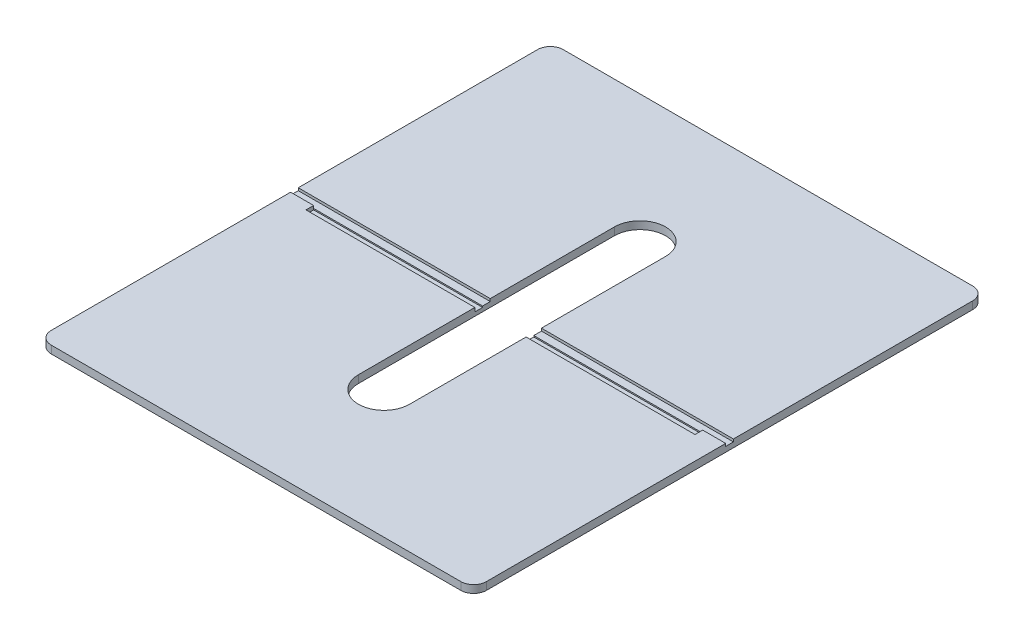
ISO-10303-21;
HEADER;
FILE_DESCRIPTION(('STEP AP214'),'2;1');
FILE_NAME('part.step','',(''),(''),'','','');
FILE_SCHEMA(('AUTOMOTIVE_DESIGN { 1 0 10303 214 1 1 1 1 }'));
ENDSEC;
DATA;
#1=APPLICATION_CONTEXT('core data for automotive mechanical design processes');
#2=APPLICATION_PROTOCOL_DEFINITION('international standard','automotive_design',2000,#1);
#3=PRODUCT_CONTEXT('',#1,'mechanical');
#4=PRODUCT('Part','Part','',(#3));
#5=PRODUCT_RELATED_PRODUCT_CATEGORY('part','',(#4));
#6=PRODUCT_DEFINITION_FORMATION('','',#4);
#7=PRODUCT_DEFINITION_CONTEXT('part definition',#1,'design');
#8=PRODUCT_DEFINITION('design','',#6,#7);
#9=PRODUCT_DEFINITION_SHAPE('','',#8);
#10=(LENGTH_UNIT() NAMED_UNIT(*) SI_UNIT(.MILLI.,.METRE.));
#11=(NAMED_UNIT(*) PLANE_ANGLE_UNIT() SI_UNIT($,.RADIAN.));
#12=(NAMED_UNIT(*) SI_UNIT($,.STERADIAN.) SOLID_ANGLE_UNIT());
#13=UNCERTAINTY_MEASURE_WITH_UNIT(LENGTH_MEASURE(1.E-05),#10,'distance_accuracy_value','');
#14=(GEOMETRIC_REPRESENTATION_CONTEXT(3) GLOBAL_UNCERTAINTY_ASSIGNED_CONTEXT((#13)) GLOBAL_UNIT_ASSIGNED_CONTEXT((#10,
#11,#12)) REPRESENTATION_CONTEXT('',''));
#15=CARTESIAN_POINT('',(0.,0.,0.));
#16=DIRECTION('',(0.,0.,1.));
#17=DIRECTION('',(1.,0.,0.));
#18=AXIS2_PLACEMENT_3D('',#15,#16,#17);
#19=CARTESIAN_POINT('',(0.,1.5,0.));
#20=DIRECTION('',(0.,1.,0.));
#21=DIRECTION('',(0.,0.,1.));
#22=AXIS2_PLACEMENT_3D('',#19,#20,#21);
#23=PLANE('',#22);
#24=DIRECTION('',(1.,0.,0.));
#25=VECTOR('',#24,1.);
#26=CARTESIAN_POINT('',(88.2289372576365,1.5,1.49999999999997));
#27=LINE('',#26,#25);
#28=CARTESIAN_POINT('',(-85.,1.5,1.50000000000002));
#29=VERTEX_POINT('',#28);
#30=CARTESIAN_POINT('',(-76.,1.5,1.5));
#31=VERTEX_POINT('',#30);
#32=EDGE_CURVE('E226',#29,#31,#27,.T.);
#33=ORIENTED_EDGE('',*,*,#32,.F.);
#34=DIRECTION('',(0.,0.,1.));
#35=VECTOR('',#34,1.);
#36=CARTESIAN_POINT('',(-85.,1.5,0.));
#37=LINE('',#36,#35);
#38=CARTESIAN_POINT('',(-85.,1.5,94.9999999999999));
#39=VERTEX_POINT('',#38);
#40=EDGE_CURVE('E239',#29,#39,#37,.T.);
#41=ORIENTED_EDGE('',*,*,#40,.T.);
#42=CARTESIAN_POINT('',(-80.,1.5,95.));
#43=DIRECTION('',(0.,1.,0.));
#44=DIRECTION('',(0.,0.,1.));
#45=AXIS2_PLACEMENT_3D('',#42,#43,#44);
#46=CIRCLE('',#45,5.);
#47=CARTESIAN_POINT('',(-79.9999999999999,1.5,100.));
#48=VERTEX_POINT('',#47);
#49=EDGE_CURVE('E254',#48,#39,#46,.F.);
#50=ORIENTED_EDGE('',*,*,#49,.F.);
#51=DIRECTION('',(1.,0.,0.));
#52=VECTOR('',#51,1.);
#53=CARTESIAN_POINT('',(0.,1.5,100.));
#54=LINE('',#53,#52);
#55=CARTESIAN_POINT('',(80.,1.5,100.));
#56=VERTEX_POINT('',#55);
#57=EDGE_CURVE('E261',#48,#56,#54,.T.);
#58=ORIENTED_EDGE('',*,*,#57,.T.);
#59=CARTESIAN_POINT('',(80.,1.5,95.));
#60=DIRECTION('',(0.,1.,0.));
#61=DIRECTION('',(0.,0.,1.));
#62=AXIS2_PLACEMENT_3D('',#59,#60,#61);
#63=CIRCLE('',#62,5.);
#64=CARTESIAN_POINT('',(85.,1.5,94.9999999999999));
#65=VERTEX_POINT('',#64);
#66=EDGE_CURVE('E263',#65,#56,#63,.F.);
#67=ORIENTED_EDGE('',*,*,#66,.F.);
#68=DIRECTION('',(0.,0.,1.));
#69=VECTOR('',#68,1.);
#70=CARTESIAN_POINT('',(85.,1.5,0.));
#71=LINE('',#70,#69);
#72=CARTESIAN_POINT('',(85.,1.5,1.49999999999997));
#73=VERTEX_POINT('',#72);
#74=EDGE_CURVE('E266',#73,#65,#71,.T.);
#75=ORIENTED_EDGE('',*,*,#74,.F.);
#76=CARTESIAN_POINT('',(76.,1.5,1.49999999999997));
#77=VERTEX_POINT('',#76);
#78=EDGE_CURVE('E244',#77,#73,#27,.T.);
#79=ORIENTED_EDGE('',*,*,#78,.F.);
#80=DIRECTION('',(0.,0.,1.));
#81=VECTOR('',#80,1.);
#82=CARTESIAN_POINT('',(76.,1.5,-3.51570624464633E-13));
#83=LINE('',#82,#81);
#84=CARTESIAN_POINT('',(76.,1.5,4.5));
#85=VERTEX_POINT('',#84);
#86=EDGE_CURVE('E328',#77,#85,#83,.T.);
#87=ORIENTED_EDGE('',*,*,#86,.T.);
#88=DIRECTION('',(-1.,0.,0.));
#89=VECTOR('',#88,1.);
#90=CARTESIAN_POINT('',(0.,1.5,4.5));
#91=LINE('',#90,#89);
#92=CARTESIAN_POINT('',(10.,1.5,4.5));
#93=VERTEX_POINT('',#92);
#94=EDGE_CURVE('E337',#85,#93,#91,.T.);
#95=ORIENTED_EDGE('',*,*,#94,.T.);
#96=DIRECTION('',(0.,0.,1.));
#97=VECTOR('',#96,1.);
#98=CARTESIAN_POINT('',(10.,1.5,0.));
#99=LINE('',#98,#97);
#100=CARTESIAN_POINT('',(10.,1.5,50.));
#101=VERTEX_POINT('',#100);
#102=EDGE_CURVE('E400',#93,#101,#99,.T.);
#103=ORIENTED_EDGE('',*,*,#102,.T.);
#104=CARTESIAN_POINT('',(0.,1.5,50.));
#105=DIRECTION('',(0.,1.,0.));
#106=DIRECTION('',(0.,0.,1.));
#107=AXIS2_PLACEMENT_3D('',#104,#105,#106);
#108=CIRCLE('',#107,10.);
#109=CARTESIAN_POINT('',(-10.,1.5,50.));
#110=VERTEX_POINT('',#109);
#111=EDGE_CURVE('E310',#110,#101,#108,.T.);
#112=ORIENTED_EDGE('',*,*,#111,.F.);
#113=DIRECTION('',(0.,0.,1.));
#114=VECTOR('',#113,1.);
#115=CARTESIAN_POINT('',(-10.,1.5,0.));
#116=LINE('',#115,#114);
#117=CARTESIAN_POINT('',(-10.,1.5,4.5));
#118=VERTEX_POINT('',#117);
#119=EDGE_CURVE('E393',#118,#110,#116,.T.);
#120=ORIENTED_EDGE('',*,*,#119,.F.);
#121=CARTESIAN_POINT('',(-76.,1.5,4.5));
#122=VERTEX_POINT('',#121);
#123=EDGE_CURVE('E340',#118,#122,#91,.T.);
#124=ORIENTED_EDGE('',*,*,#123,.T.);
#125=DIRECTION('',(0.,0.,-1.));
#126=VECTOR('',#125,1.);
#127=CARTESIAN_POINT('',(-76.,1.5,3.51570624464633E-13));
#128=LINE('',#127,#126);
#129=EDGE_CURVE('E242',#122,#31,#128,.T.);
#130=ORIENTED_EDGE('',*,*,#129,.T.);
#131=EDGE_LOOP('',(#33,#41,#50,#58,#67,#75,#79,#87,#95,#103,#112,#120,#124,#130));
#132=FACE_BOUND('',#131,.T.);
#133=ADVANCED_FACE('F43',(#132),#23,.T.);
#134=CARTESIAN_POINT('',(-76.,1.500012,1.5));
#135=DIRECTION('',(0.,0.,1.));
#136=DIRECTION('',(1.,0.,0.));
#137=AXIS2_PLACEMENT_3D('',#134,#135,#136);
#138=PLANE('',#137);
#139=DIRECTION('',(0.,-1.,0.));
#140=VECTOR('',#139,1.);
#141=CARTESIAN_POINT('',(76.,1.500012,1.5));
#142=LINE('',#141,#140);
#143=CARTESIAN_POINT('',(76.,0.5,1.49999999999997));
#144=VERTEX_POINT('',#143);
#145=CARTESIAN_POINT('',(76.,0.,1.5));
#146=VERTEX_POINT('',#145);
#147=EDGE_CURVE('E373',#144,#146,#142,.T.);
#148=ORIENTED_EDGE('',*,*,#147,.F.);
#149=DIRECTION('',(1.,0.,0.));
#150=VECTOR('',#149,1.);
#151=CARTESIAN_POINT('',(88.2289372576365,0.5,1.49999999999997));
#152=LINE('',#151,#150);
#153=CARTESIAN_POINT('',(10.,0.5,1.5));
#154=VERTEX_POINT('',#153);
#155=EDGE_CURVE('E464',#154,#144,#152,.T.);
#156=ORIENTED_EDGE('',*,*,#155,.F.);
#157=DIRECTION('',(0.,-1.,0.));
#158=VECTOR('',#157,1.);
#159=CARTESIAN_POINT('',(10.,1.5,1.5));
#160=LINE('',#159,#158);
#161=CARTESIAN_POINT('',(10.,0.,1.5));
#162=VERTEX_POINT('',#161);
#163=EDGE_CURVE('E346',#154,#162,#160,.T.);
#164=ORIENTED_EDGE('',*,*,#163,.T.);
#165=DIRECTION('',(-1.,0.,0.));
#166=VECTOR('',#165,1.);
#167=CARTESIAN_POINT('',(-76.,0.,1.5));
#168=LINE('',#167,#166);
#169=EDGE_CURVE('E357',#146,#162,#168,.T.);
#170=ORIENTED_EDGE('',*,*,#169,.F.);
#171=EDGE_LOOP('',(#148,#156,#164,#170));
#172=FACE_BOUND('',#171,.T.);
#173=ADVANCED_FACE('F501',(#172),#138,.T.);
#174=DIRECTION('',(0.,-1.,0.));
#175=VECTOR('',#174,1.);
#176=CARTESIAN_POINT('',(-10.,1.5,1.5));
#177=LINE('',#176,#175);
#178=CARTESIAN_POINT('',(-10.,0.5,1.5));
#179=VERTEX_POINT('',#178);
#180=CARTESIAN_POINT('',(-10.,0.,1.5));
#181=VERTEX_POINT('',#180);
#182=EDGE_CURVE('E387',#179,#181,#177,.T.);
#183=ORIENTED_EDGE('',*,*,#182,.F.);
#184=CARTESIAN_POINT('',(-76.,0.5,1.50000000000002));
#185=VERTEX_POINT('',#184);
#186=EDGE_CURVE('E462',#185,#179,#152,.T.);
#187=ORIENTED_EDGE('',*,*,#186,.F.);
#188=DIRECTION('',(0.,-1.,0.));
#189=VECTOR('',#188,1.);
#190=CARTESIAN_POINT('',(-76.,1.500012,1.5));
#191=LINE('',#190,#189);
#192=CARTESIAN_POINT('',(-76.,0.,1.5));
#193=VERTEX_POINT('',#192);
#194=EDGE_CURVE('E379',#185,#193,#191,.T.);
#195=ORIENTED_EDGE('',*,*,#194,.T.);
#196=EDGE_CURVE('E443',#181,#193,#168,.T.);
#197=ORIENTED_EDGE('',*,*,#196,.F.);
#198=EDGE_LOOP('',(#183,#187,#195,#197));
#199=FACE_BOUND('',#198,.T.);
#200=ADVANCED_FACE('F461',(#199),#138,.T.);
#201=CARTESIAN_POINT('',(-10.,1.5,0.));
#202=DIRECTION('',(1.,0.,0.));
#203=DIRECTION('',(0.,0.,-1.));
#204=AXIS2_PLACEMENT_3D('',#201,#202,#203);
#205=PLANE('',#204);
#206=DIRECTION('',(0.,1.,0.));
#207=VECTOR('',#206,1.);
#208=CARTESIAN_POINT('',(-10.,1.5,-1.5));
#209=LINE('',#208,#207);
#210=CARTESIAN_POINT('',(-10.,0.5,-1.5));
#211=VERTEX_POINT('',#210);
#212=CARTESIAN_POINT('',(-10.,1.5,-1.5));
#213=VERTEX_POINT('',#212);
#214=EDGE_CURVE('E437',#211,#213,#209,.T.);
#215=ORIENTED_EDGE('',*,*,#214,.F.);
#216=DIRECTION('',(0.,0.,1.));
#217=VECTOR('',#216,1.);
#218=CARTESIAN_POINT('',(-10.,0.5,0.));
#219=LINE('',#218,#217);
#220=EDGE_CURVE('E434',#211,#179,#219,.T.);
#221=ORIENTED_EDGE('',*,*,#220,.T.);
#222=ORIENTED_EDGE('',*,*,#182,.T.);
#223=DIRECTION('',(0.,0.,-1.));
#224=VECTOR('',#223,1.);
#225=CARTESIAN_POINT('',(-10.,0.,0.));
#226=LINE('',#225,#224);
#227=CARTESIAN_POINT('',(-10.,0.,4.5));
#228=VERTEX_POINT('',#227);
#229=EDGE_CURVE('E278',#228,#181,#226,.T.);
#230=ORIENTED_EDGE('',*,*,#229,.F.);
#231=DIRECTION('',(0.,1.,0.));
#232=VECTOR('',#231,1.);
#233=CARTESIAN_POINT('',(-10.,1.5,4.5));
#234=LINE('',#233,#232);
#235=EDGE_CURVE('E382',#228,#118,#234,.T.);
#236=ORIENTED_EDGE('',*,*,#235,.T.);
#237=ORIENTED_EDGE('',*,*,#119,.T.);
#238=DIRECTION('',(0.,-1.,0.));
#239=VECTOR('',#238,1.);
#240=CARTESIAN_POINT('',(-10.,1.5,50.));
#241=LINE('',#240,#239);
#242=CARTESIAN_POINT('',(-10.,-1.5,50.));
#243=VERTEX_POINT('',#242);
#244=EDGE_CURVE('E314',#110,#243,#241,.T.);
#245=ORIENTED_EDGE('',*,*,#244,.T.);
#246=DIRECTION('',(0.,0.,1.));
#247=VECTOR('',#246,1.);
#248=CARTESIAN_POINT('',(-10.,-1.5,0.));
#249=LINE('',#248,#247);
#250=CARTESIAN_POINT('',(-10.,-1.5,-50.));
#251=VERTEX_POINT('',#250);
#252=EDGE_CURVE('E277',#251,#243,#249,.T.);
#253=ORIENTED_EDGE('',*,*,#252,.F.);
#254=DIRECTION('',(0.,-1.,0.));
#255=VECTOR('',#254,1.);
#256=CARTESIAN_POINT('',(-10.,1.5,-50.));
#257=LINE('',#256,#255);
#258=CARTESIAN_POINT('',(-10.,1.5,-50.));
#259=VERTEX_POINT('',#258);
#260=EDGE_CURVE('E332',#259,#251,#257,.T.);
#261=ORIENTED_EDGE('',*,*,#260,.F.);
#262=EDGE_CURVE('E394',#259,#213,#116,.T.);
#263=ORIENTED_EDGE('',*,*,#262,.T.);
#264=EDGE_LOOP('',(#215,#221,#222,#230,#236,#237,#245,#253,#261,#263));
#265=FACE_BOUND('',#264,.T.);
#266=ADVANCED_FACE('F458',(#265),#205,.T.);
#267=CARTESIAN_POINT('',(10.,1.5,0.));
#268=DIRECTION('',(1.,0.,0.));
#269=DIRECTION('',(0.,0.,-1.));
#270=AXIS2_PLACEMENT_3D('',#267,#268,#269);
#271=PLANE('',#270);
#272=DIRECTION('',(0.,0.,1.));
#273=VECTOR('',#272,1.);
#274=CARTESIAN_POINT('',(10.,0.5,0.));
#275=LINE('',#274,#273);
#276=CARTESIAN_POINT('',(10.,0.5,-1.50000000000001));
#277=VERTEX_POINT('',#276);
#278=EDGE_CURVE('E58',#277,#154,#275,.T.);
#279=ORIENTED_EDGE('',*,*,#278,.F.);
#280=DIRECTION('',(0.,1.,0.));
#281=VECTOR('',#280,1.);
#282=CARTESIAN_POINT('',(10.,1.5,-1.50000000000001));
#283=LINE('',#282,#281);
#284=CARTESIAN_POINT('',(10.,1.5,-1.50000000000001));
#285=VERTEX_POINT('',#284);
#286=EDGE_CURVE('E433',#277,#285,#283,.T.);
#287=ORIENTED_EDGE('',*,*,#286,.T.);
#288=CARTESIAN_POINT('',(10.,1.5,-50.));
#289=VERTEX_POINT('',#288);
#290=EDGE_CURVE('E401',#289,#285,#99,.T.);
#291=ORIENTED_EDGE('',*,*,#290,.F.);
#292=DIRECTION('',(0.,-1.,0.));
#293=VECTOR('',#292,1.);
#294=CARTESIAN_POINT('',(10.,1.5,-50.));
#295=LINE('',#294,#293);
#296=CARTESIAN_POINT('',(10.,-1.5,-50.));
#297=VERTEX_POINT('',#296);
#298=EDGE_CURVE('E330',#289,#297,#295,.T.);
#299=ORIENTED_EDGE('',*,*,#298,.T.);
#300=DIRECTION('',(0.,0.,1.));
#301=VECTOR('',#300,1.);
#302=CARTESIAN_POINT('',(10.,-1.5,0.));
#303=LINE('',#302,#301);
#304=CARTESIAN_POINT('',(10.,-1.5,50.));
#305=VERTEX_POINT('',#304);
#306=EDGE_CURVE('E284',#297,#305,#303,.T.);
#307=ORIENTED_EDGE('',*,*,#306,.T.);
#308=DIRECTION('',(0.,-1.,0.));
#309=VECTOR('',#308,1.);
#310=CARTESIAN_POINT('',(10.,1.5,50.));
#311=LINE('',#310,#309);
#312=EDGE_CURVE('E273',#101,#305,#311,.T.);
#313=ORIENTED_EDGE('',*,*,#312,.F.);
#314=ORIENTED_EDGE('',*,*,#102,.F.);
#315=DIRECTION('',(0.,1.,0.));
#316=VECTOR('',#315,1.);
#317=CARTESIAN_POINT('',(10.,1.5,4.5));
#318=LINE('',#317,#316);
#319=CARTESIAN_POINT('',(10.,0.,4.5));
#320=VERTEX_POINT('',#319);
#321=EDGE_CURVE('E348',#320,#93,#318,.T.);
#322=ORIENTED_EDGE('',*,*,#321,.F.);
#323=DIRECTION('',(0.,0.,-1.));
#324=VECTOR('',#323,1.);
#325=CARTESIAN_POINT('',(10.,0.,0.));
#326=LINE('',#325,#324);
#327=EDGE_CURVE('E51',#320,#162,#326,.T.);
#328=ORIENTED_EDGE('',*,*,#327,.T.);
#329=ORIENTED_EDGE('',*,*,#163,.F.);
#330=EDGE_LOOP('',(#279,#287,#291,#299,#307,#313,#314,#322,#328,#329));
#331=FACE_BOUND('',#330,.T.);
#332=ADVANCED_FACE('F345',(#331),#271,.F.);
#333=DIRECTION('',(-1.,0.,0.));
#334=VECTOR('',#333,1.);
#335=CARTESIAN_POINT('',(88.2289372576365,1.5,-1.50000000000003));
#336=LINE('',#335,#334);
#337=CARTESIAN_POINT('',(85.,1.5,-1.50000000000003));
#338=VERTEX_POINT('',#337);
#339=EDGE_CURVE('E471',#338,#285,#336,.T.);
#340=ORIENTED_EDGE('',*,*,#339,.F.);
#341=CARTESIAN_POINT('',(85.,1.5,-95.));
#342=VERTEX_POINT('',#341);
#343=EDGE_CURVE('E267',#342,#338,#71,.T.);
#344=ORIENTED_EDGE('',*,*,#343,.F.);
#345=CARTESIAN_POINT('',(80.,1.5,-95.));
#346=DIRECTION('',(0.,1.,0.));
#347=DIRECTION('',(0.,0.,1.));
#348=AXIS2_PLACEMENT_3D('',#345,#346,#347);
#349=CIRCLE('',#348,5.);
#350=CARTESIAN_POINT('',(79.9999999999999,1.5,-100.));
#351=VERTEX_POINT('',#350);
#352=EDGE_CURVE('E270',#351,#342,#349,.F.);
#353=ORIENTED_EDGE('',*,*,#352,.F.);
#354=DIRECTION('',(1.,0.,0.));
#355=VECTOR('',#354,1.);
#356=CARTESIAN_POINT('',(0.,1.5,-100.));
#357=LINE('',#356,#355);
#358=CARTESIAN_POINT('',(-80.,1.5,-100.));
#359=VERTEX_POINT('',#358);
#360=EDGE_CURVE('E256',#359,#351,#357,.T.);
#361=ORIENTED_EDGE('',*,*,#360,.F.);
#362=CARTESIAN_POINT('',(-80.,1.5,-95.));
#363=DIRECTION('',(0.,1.,0.));
#364=DIRECTION('',(0.,0.,1.));
#365=AXIS2_PLACEMENT_3D('',#362,#363,#364);
#366=CIRCLE('',#365,5.);
#367=CARTESIAN_POINT('',(-85.,1.5,-95.));
#368=VERTEX_POINT('',#367);
#369=EDGE_CURVE('E251',#359,#368,#366,.T.);
#370=ORIENTED_EDGE('',*,*,#369,.T.);
#371=CARTESIAN_POINT('',(-85.,1.5,-1.49999999999998));
#372=VERTEX_POINT('',#371);
#373=EDGE_CURVE('E250',#368,#372,#37,.T.);
#374=ORIENTED_EDGE('',*,*,#373,.T.);
#375=EDGE_CURVE('E426',#213,#372,#336,.T.);
#376=ORIENTED_EDGE('',*,*,#375,.F.);
#377=ORIENTED_EDGE('',*,*,#262,.F.);
#378=CARTESIAN_POINT('',(0.,1.5,-50.));
#379=DIRECTION('',(0.,1.,0.));
#380=DIRECTION('',(0.,0.,1.));
#381=AXIS2_PLACEMENT_3D('',#378,#379,#380);
#382=CIRCLE('',#381,10.);
#383=EDGE_CURVE('E397',#289,#259,#382,.T.);
#384=ORIENTED_EDGE('',*,*,#383,.F.);
#385=ORIENTED_EDGE('',*,*,#290,.T.);
#386=EDGE_LOOP('',(#340,#344,#353,#361,#370,#374,#376,#377,#384,#385));
#387=FACE_BOUND('',#386,.T.);
#388=ADVANCED_FACE('F413',(#387),#23,.T.);
#389=CARTESIAN_POINT('',(0.,1.5,-100.));
#390=DIRECTION('',(0.,0.,-1.));
#391=DIRECTION('',(-1.,0.,0.));
#392=AXIS2_PLACEMENT_3D('',#389,#390,#391);
#393=PLANE('',#392);
#394=DIRECTION('',(1.,0.,0.));
#395=VECTOR('',#394,1.);
#396=CARTESIAN_POINT('',(0.,-1.5,-100.));
#397=LINE('',#396,#395);
#398=CARTESIAN_POINT('',(-80.,-1.5,-100.));
#399=VERTEX_POINT('',#398);
#400=CARTESIAN_POINT('',(79.9999999999999,-1.5,-100.));
#401=VERTEX_POINT('',#400);
#402=EDGE_CURVE('E287',#399,#401,#397,.T.);
#403=ORIENTED_EDGE('',*,*,#402,.F.);
#404=DIRECTION('',(0.,-1.,0.));
#405=VECTOR('',#404,1.);
#406=CARTESIAN_POINT('',(-80.,1.5,-100.));
#407=LINE('',#406,#405);
#408=EDGE_CURVE('E326',#359,#399,#407,.T.);
#409=ORIENTED_EDGE('',*,*,#408,.F.);
#410=ORIENTED_EDGE('',*,*,#360,.T.);
#411=DIRECTION('',(0.,-1.,0.));
#412=VECTOR('',#411,1.);
#413=CARTESIAN_POINT('',(79.9999999999999,1.5,-100.));
#414=LINE('',#413,#412);
#415=EDGE_CURVE('E311',#351,#401,#414,.T.);
#416=ORIENTED_EDGE('',*,*,#415,.T.);
#417=EDGE_LOOP('',(#403,#409,#410,#416));
#418=FACE_BOUND('',#417,.T.);
#419=ADVANCED_FACE('F408',(#418),#393,.T.);
#420=CARTESIAN_POINT('',(-80.,1.5,-95.));
#421=DIRECTION('',(0.,-1.,0.));
#422=DIRECTION('',(0.,0.,-1.));
#423=AXIS2_PLACEMENT_3D('',#420,#421,#422);
#424=CYLINDRICAL_SURFACE('',#423,5.);
#425=CARTESIAN_POINT('',(-80.,-1.5,-95.));
#426=DIRECTION('',(0.,1.,0.));
#427=DIRECTION('',(0.,0.,1.));
#428=AXIS2_PLACEMENT_3D('',#425,#426,#427);
#429=CIRCLE('',#428,5.);
#430=CARTESIAN_POINT('',(-85.,-1.5,-95.));
#431=VERTEX_POINT('',#430);
#432=EDGE_CURVE('E290',#399,#431,#429,.T.);
#433=ORIENTED_EDGE('',*,*,#432,.T.);
#434=DIRECTION('',(0.,-1.,0.));
#435=VECTOR('',#434,1.);
#436=CARTESIAN_POINT('',(-85.,1.5,-95.));
#437=LINE('',#436,#435);
#438=EDGE_CURVE('E323',#368,#431,#437,.T.);
#439=ORIENTED_EDGE('',*,*,#438,.F.);
#440=ORIENTED_EDGE('',*,*,#369,.F.);
#441=ORIENTED_EDGE('',*,*,#408,.T.);
#442=EDGE_LOOP('',(#433,#439,#440,#441));
#443=FACE_BOUND('',#442,.T.);
#444=ADVANCED_FACE('F423',(#443),#424,.T.);
#445=CARTESIAN_POINT('',(-85.,1.5,0.));
#446=DIRECTION('',(1.,0.,0.));
#447=DIRECTION('',(0.,0.,-1.));
#448=AXIS2_PLACEMENT_3D('',#445,#446,#447);
#449=PLANE('',#448);
#450=ORIENTED_EDGE('',*,*,#40,.F.);
#451=DIRECTION('',(0.,-1.,0.));
#452=VECTOR('',#451,1.);
#453=CARTESIAN_POINT('',(-85.,1.5,1.50000000000002));
#454=LINE('',#453,#452);
#455=CARTESIAN_POINT('',(-85.,0.5,1.50000000000002));
#456=VERTEX_POINT('',#455);
#457=EDGE_CURVE('E223',#29,#456,#454,.T.);
#458=ORIENTED_EDGE('',*,*,#457,.T.);
#459=DIRECTION('',(0.,0.,1.));
#460=VECTOR('',#459,1.);
#461=CARTESIAN_POINT('',(-85.,0.5,0.));
#462=LINE('',#461,#460);
#463=CARTESIAN_POINT('',(-85.,0.5,-1.49999999999998));
#464=VERTEX_POINT('',#463);
#465=EDGE_CURVE('E429',#464,#456,#462,.T.);
#466=ORIENTED_EDGE('',*,*,#465,.F.);
#467=DIRECTION('',(0.,1.,0.));
#468=VECTOR('',#467,1.);
#469=CARTESIAN_POINT('',(-85.,1.5,-1.49999999999998));
#470=LINE('',#469,#468);
#471=EDGE_CURVE('E428',#464,#372,#470,.T.);
#472=ORIENTED_EDGE('',*,*,#471,.T.);
#473=ORIENTED_EDGE('',*,*,#373,.F.);
#474=ORIENTED_EDGE('',*,*,#438,.T.);
#475=DIRECTION('',(0.,0.,1.));
#476=VECTOR('',#475,1.);
#477=CARTESIAN_POINT('',(-85.,-1.5,0.));
#478=LINE('',#477,#476);
#479=CARTESIAN_POINT('',(-85.,-1.5,94.9999999999999));
#480=VERTEX_POINT('',#479);
#481=EDGE_CURVE('E293',#431,#480,#478,.T.);
#482=ORIENTED_EDGE('',*,*,#481,.T.);
#483=DIRECTION('',(0.,-1.,0.));
#484=VECTOR('',#483,1.);
#485=CARTESIAN_POINT('',(-85.,1.5,94.9999999999999));
#486=LINE('',#485,#484);
#487=EDGE_CURVE('E248',#39,#480,#486,.T.);
#488=ORIENTED_EDGE('',*,*,#487,.F.);
#489=EDGE_LOOP('',(#450,#458,#466,#472,#473,#474,#482,#488));
#490=FACE_BOUND('',#489,.T.);
#491=ADVANCED_FACE('F246',(#490),#449,.F.);
#492=CARTESIAN_POINT('',(-80.,1.5,95.));
#493=DIRECTION('',(0.,-1.,0.));
#494=DIRECTION('',(0.,0.,-1.));
#495=AXIS2_PLACEMENT_3D('',#492,#493,#494);
#496=CYLINDRICAL_SURFACE('',#495,5.);
#497=CARTESIAN_POINT('',(-80.,-1.5,95.));
#498=DIRECTION('',(0.,1.,0.));
#499=DIRECTION('',(0.,0.,1.));
#500=AXIS2_PLACEMENT_3D('',#497,#498,#499);
#501=CIRCLE('',#500,5.);
#502=CARTESIAN_POINT('',(-79.9999999999999,-1.5,100.));
#503=VERTEX_POINT('',#502);
#504=EDGE_CURVE('E295',#503,#480,#501,.F.);
#505=ORIENTED_EDGE('',*,*,#504,.F.);
#506=DIRECTION('',(0.,-1.,0.));
#507=VECTOR('',#506,1.);
#508=CARTESIAN_POINT('',(-79.9999999999999,1.5,100.));
#509=LINE('',#508,#507);
#510=EDGE_CURVE('E320',#48,#503,#509,.T.);
#511=ORIENTED_EDGE('',*,*,#510,.F.);
#512=ORIENTED_EDGE('',*,*,#49,.T.);
#513=ORIENTED_EDGE('',*,*,#487,.T.);
#514=EDGE_LOOP('',(#505,#511,#512,#513));
#515=FACE_BOUND('',#514,.T.);
#516=ADVANCED_FACE('F560',(#515),#496,.T.);
#517=CARTESIAN_POINT('',(0.,1.5,100.));
#518=DIRECTION('',(0.,0.,-1.));
#519=DIRECTION('',(-1.,0.,0.));
#520=AXIS2_PLACEMENT_3D('',#517,#518,#519);
#521=PLANE('',#520);
#522=DIRECTION('',(1.,0.,0.));
#523=VECTOR('',#522,1.);
#524=CARTESIAN_POINT('',(0.,-1.5,100.));
#525=LINE('',#524,#523);
#526=CARTESIAN_POINT('',(80.,-1.5,100.));
#527=VERTEX_POINT('',#526);
#528=EDGE_CURVE('E298',#503,#527,#525,.T.);
#529=ORIENTED_EDGE('',*,*,#528,.T.);
#530=DIRECTION('',(0.,-1.,0.));
#531=VECTOR('',#530,1.);
#532=CARTESIAN_POINT('',(80.,1.5,100.));
#533=LINE('',#532,#531);
#534=EDGE_CURVE('E318',#56,#527,#533,.T.);
#535=ORIENTED_EDGE('',*,*,#534,.F.);
#536=ORIENTED_EDGE('',*,*,#57,.F.);
#537=ORIENTED_EDGE('',*,*,#510,.T.);
#538=EDGE_LOOP('',(#529,#535,#536,#537));
#539=FACE_BOUND('',#538,.T.);
#540=ADVANCED_FACE('F554',(#539),#521,.F.);
#541=CARTESIAN_POINT('',(80.,1.5,95.));
#542=DIRECTION('',(0.,-1.,0.));
#543=DIRECTION('',(0.,0.,-1.));
#544=AXIS2_PLACEMENT_3D('',#541,#542,#543);
#545=CYLINDRICAL_SURFACE('',#544,5.);
#546=CARTESIAN_POINT('',(80.,-1.5,95.));
#547=DIRECTION('',(0.,1.,0.));
#548=DIRECTION('',(0.,0.,1.));
#549=AXIS2_PLACEMENT_3D('',#546,#547,#548);
#550=CIRCLE('',#549,5.);
#551=CARTESIAN_POINT('',(85.,-1.5,94.9999999999999));
#552=VERTEX_POINT('',#551);
#553=EDGE_CURVE('E301',#552,#527,#550,.F.);
#554=ORIENTED_EDGE('',*,*,#553,.F.);
#555=DIRECTION('',(0.,-1.,0.));
#556=VECTOR('',#555,1.);
#557=CARTESIAN_POINT('',(85.,1.5,94.9999999999999));
#558=LINE('',#557,#556);
#559=EDGE_CURVE('E316',#65,#552,#558,.T.);
#560=ORIENTED_EDGE('',*,*,#559,.F.);
#561=ORIENTED_EDGE('',*,*,#66,.T.);
#562=ORIENTED_EDGE('',*,*,#534,.T.);
#563=EDGE_LOOP('',(#554,#560,#561,#562));
#564=FACE_BOUND('',#563,.T.);
#565=ADVANCED_FACE('F549',(#564),#545,.T.);
#566=CARTESIAN_POINT('',(85.,1.5,0.));
#567=DIRECTION('',(1.,0.,0.));
#568=DIRECTION('',(0.,0.,-1.));
#569=AXIS2_PLACEMENT_3D('',#566,#567,#568);
#570=PLANE('',#569);
#571=DIRECTION('',(0.,-1.,0.));
#572=VECTOR('',#571,1.);
#573=CARTESIAN_POINT('',(85.,1.5,1.49999999999997));
#574=LINE('',#573,#572);
#575=CARTESIAN_POINT('',(85.,0.5,1.49999999999997));
#576=VERTEX_POINT('',#575);
#577=EDGE_CURVE('E234',#73,#576,#574,.T.);
#578=ORIENTED_EDGE('',*,*,#577,.F.);
#579=ORIENTED_EDGE('',*,*,#74,.T.);
#580=ORIENTED_EDGE('',*,*,#559,.T.);
#581=DIRECTION('',(0.,0.,1.));
#582=VECTOR('',#581,1.);
#583=CARTESIAN_POINT('',(85.,-1.5,0.));
#584=LINE('',#583,#582);
#585=CARTESIAN_POINT('',(85.,-1.5,-95.));
#586=VERTEX_POINT('',#585);
#587=EDGE_CURVE('E304',#586,#552,#584,.T.);
#588=ORIENTED_EDGE('',*,*,#587,.F.);
#589=DIRECTION('',(0.,-1.,0.));
#590=VECTOR('',#589,1.);
#591=CARTESIAN_POINT('',(85.,1.5,-95.));
#592=LINE('',#591,#590);
#593=EDGE_CURVE('E313',#342,#586,#592,.T.);
#594=ORIENTED_EDGE('',*,*,#593,.F.);
#595=ORIENTED_EDGE('',*,*,#343,.T.);
#596=DIRECTION('',(0.,1.,0.));
#597=VECTOR('',#596,1.);
#598=CARTESIAN_POINT('',(85.,1.5,-1.50000000000003));
#599=LINE('',#598,#597);
#600=CARTESIAN_POINT('',(85.,0.5,-1.50000000000003));
#601=VERTEX_POINT('',#600);
#602=EDGE_CURVE('E11',#601,#338,#599,.T.);
#603=ORIENTED_EDGE('',*,*,#602,.F.);
#604=DIRECTION('',(0.,0.,1.));
#605=VECTOR('',#604,1.);
#606=CARTESIAN_POINT('',(85.,0.5,0.));
#607=LINE('',#606,#605);
#608=EDGE_CURVE('E233',#601,#576,#607,.T.);
#609=ORIENTED_EDGE('',*,*,#608,.T.);
#610=EDGE_LOOP('',(#578,#579,#580,#588,#594,#595,#603,#609));
#611=FACE_BOUND('',#610,.T.);
#612=ADVANCED_FACE('F505',(#611),#570,.T.);
#613=CARTESIAN_POINT('',(0.,1.5,50.));
#614=DIRECTION('',(0.,-1.,0.));
#615=DIRECTION('',(0.,0.,-1.));
#616=AXIS2_PLACEMENT_3D('',#613,#614,#615);
#617=CYLINDRICAL_SURFACE('',#616,10.);
#618=CARTESIAN_POINT('',(0.,-1.5,50.));
#619=DIRECTION('',(0.,1.,0.));
#620=DIRECTION('',(0.,0.,1.));
#621=AXIS2_PLACEMENT_3D('',#618,#619,#620);
#622=CIRCLE('',#621,10.);
#623=EDGE_CURVE('E274',#243,#305,#622,.T.);
#624=ORIENTED_EDGE('',*,*,#623,.F.);
#625=ORIENTED_EDGE('',*,*,#244,.F.);
#626=ORIENTED_EDGE('',*,*,#111,.T.);
#627=ORIENTED_EDGE('',*,*,#312,.T.);
#628=EDGE_LOOP('',(#624,#625,#626,#627));
#629=FACE_BOUND('',#628,.T.);
#630=ADVANCED_FACE('F45',(#629),#617,.F.);
#631=CARTESIAN_POINT('',(0.,1.5,-50.));
#632=DIRECTION('',(0.,-1.,0.));
#633=DIRECTION('',(0.,0.,-1.));
#634=AXIS2_PLACEMENT_3D('',#631,#632,#633);
#635=CYLINDRICAL_SURFACE('',#634,10.);
#636=CARTESIAN_POINT('',(0.,-1.5,-50.));
#637=DIRECTION('',(0.,1.,0.));
#638=DIRECTION('',(0.,0.,1.));
#639=AXIS2_PLACEMENT_3D('',#636,#637,#638);
#640=CIRCLE('',#639,10.);
#641=EDGE_CURVE('E281',#297,#251,#640,.T.);
#642=ORIENTED_EDGE('',*,*,#641,.F.);
#643=ORIENTED_EDGE('',*,*,#298,.F.);
#644=ORIENTED_EDGE('',*,*,#383,.T.);
#645=ORIENTED_EDGE('',*,*,#260,.T.);
#646=EDGE_LOOP('',(#642,#643,#644,#645));
#647=FACE_BOUND('',#646,.T.);
#648=ADVANCED_FACE('F485',(#647),#635,.F.);
#649=CARTESIAN_POINT('',(80.,1.5,-95.));
#650=DIRECTION('',(0.,-1.,0.));
#651=DIRECTION('',(0.,0.,-1.));
#652=AXIS2_PLACEMENT_3D('',#649,#650,#651);
#653=CYLINDRICAL_SURFACE('',#652,5.);
#654=CARTESIAN_POINT('',(80.,-1.5,-95.));
#655=DIRECTION('',(0.,1.,0.));
#656=DIRECTION('',(0.,0.,1.));
#657=AXIS2_PLACEMENT_3D('',#654,#655,#656);
#658=CIRCLE('',#657,5.);
#659=EDGE_CURVE('E307',#401,#586,#658,.F.);
#660=ORIENTED_EDGE('',*,*,#659,.F.);
#661=ORIENTED_EDGE('',*,*,#415,.F.);
#662=ORIENTED_EDGE('',*,*,#352,.T.);
#663=ORIENTED_EDGE('',*,*,#593,.T.);
#664=EDGE_LOOP('',(#660,#661,#662,#663));
#665=FACE_BOUND('',#664,.T.);
#666=ADVANCED_FACE('F416',(#665),#653,.T.);
#667=CARTESIAN_POINT('',(0.,-1.5,0.));
#668=DIRECTION('',(0.,1.,0.));
#669=DIRECTION('',(0.,0.,1.));
#670=AXIS2_PLACEMENT_3D('',#667,#668,#669);
#671=PLANE('',#670);
#672=ORIENTED_EDGE('',*,*,#623,.T.);
#673=ORIENTED_EDGE('',*,*,#306,.F.);
#674=ORIENTED_EDGE('',*,*,#641,.T.);
#675=ORIENTED_EDGE('',*,*,#252,.T.);
#676=EDGE_LOOP('',(#672,#673,#674,#675));
#677=FACE_BOUND('',#676,.T.);
#678=ORIENTED_EDGE('',*,*,#402,.T.);
#679=ORIENTED_EDGE('',*,*,#659,.T.);
#680=ORIENTED_EDGE('',*,*,#587,.T.);
#681=ORIENTED_EDGE('',*,*,#553,.T.);
#682=ORIENTED_EDGE('',*,*,#528,.F.);
#683=ORIENTED_EDGE('',*,*,#504,.T.);
#684=ORIENTED_EDGE('',*,*,#481,.F.);
#685=ORIENTED_EDGE('',*,*,#432,.F.);
#686=EDGE_LOOP('',(#678,#679,#680,#681,#682,#683,#684,#685));
#687=FACE_BOUND('',#686,.T.);
#688=ADVANCED_FACE('F419',(#677,#687),#671,.F.);
#689=CARTESIAN_POINT('',(76.,1.500012,1.5));
#690=DIRECTION('',(-1.,0.,0.));
#691=DIRECTION('',(0.,0.,1.));
#692=AXIS2_PLACEMENT_3D('',#689,#690,#691);
#693=PLANE('',#692);
#694=EDGE_CURVE('E374',#77,#144,#142,.T.);
#695=ORIENTED_EDGE('',*,*,#694,.T.);
#696=ORIENTED_EDGE('',*,*,#147,.T.);
#697=DIRECTION('',(0.,0.,-1.));
#698=VECTOR('',#697,1.);
#699=CARTESIAN_POINT('',(76.,0.,1.5));
#700=LINE('',#699,#698);
#701=CARTESIAN_POINT('',(76.,0.,4.5));
#702=VERTEX_POINT('',#701);
#703=EDGE_CURVE('E367',#702,#146,#700,.T.);
#704=ORIENTED_EDGE('',*,*,#703,.F.);
#705=DIRECTION('',(0.,-1.,0.));
#706=VECTOR('',#705,1.);
#707=CARTESIAN_POINT('',(76.,1.500012,4.5));
#708=LINE('',#707,#706);
#709=EDGE_CURVE('E361',#85,#702,#708,.T.);
#710=ORIENTED_EDGE('',*,*,#709,.F.);
#711=ORIENTED_EDGE('',*,*,#86,.F.);
#712=EDGE_LOOP('',(#695,#696,#704,#710,#711));
#713=FACE_BOUND('',#712,.T.);
#714=ADVANCED_FACE('F498',(#713),#693,.T.);
#715=CARTESIAN_POINT('',(-76.,1.500012,4.5));
#716=DIRECTION('',(0.,0.,-1.));
#717=DIRECTION('',(-1.,0.,0.));
#718=AXIS2_PLACEMENT_3D('',#715,#716,#717);
#719=PLANE('',#718);
#720=ORIENTED_EDGE('',*,*,#321,.T.);
#721=ORIENTED_EDGE('',*,*,#94,.F.);
#722=ORIENTED_EDGE('',*,*,#709,.T.);
#723=DIRECTION('',(1.,0.,0.));
#724=VECTOR('',#723,1.);
#725=CARTESIAN_POINT('',(-76.,0.,4.5));
#726=LINE('',#725,#724);
#727=EDGE_CURVE('E354',#320,#702,#726,.T.);
#728=ORIENTED_EDGE('',*,*,#727,.F.);
#729=EDGE_LOOP('',(#720,#721,#722,#728));
#730=FACE_BOUND('',#729,.T.);
#731=ADVANCED_FACE('F359',(#730),#719,.T.);
#732=CARTESIAN_POINT('',(0.,0.,0.));
#733=DIRECTION('',(0.,-1.,0.));
#734=DIRECTION('',(0.,0.,-1.));
#735=AXIS2_PLACEMENT_3D('',#732,#733,#734);
#736=PLANE('',#735);
#737=ORIENTED_EDGE('',*,*,#727,.T.);
#738=ORIENTED_EDGE('',*,*,#703,.T.);
#739=ORIENTED_EDGE('',*,*,#169,.T.);
#740=ORIENTED_EDGE('',*,*,#327,.F.);
#741=EDGE_LOOP('',(#737,#738,#739,#740));
#742=FACE_BOUND('',#741,.T.);
#743=ADVANCED_FACE('F352',(#742),#736,.F.);
#744=CARTESIAN_POINT('',(-76.,1.500012,1.5));
#745=DIRECTION('',(1.,0.,0.));
#746=DIRECTION('',(0.,0.,-1.));
#747=AXIS2_PLACEMENT_3D('',#744,#745,#746);
#748=PLANE('',#747);
#749=DIRECTION('',(0.,-1.,0.));
#750=VECTOR('',#749,1.);
#751=CARTESIAN_POINT('',(-76.,1.500012,4.5));
#752=LINE('',#751,#750);
#753=CARTESIAN_POINT('',(-76.,0.,4.5));
#754=VERTEX_POINT('',#753);
#755=EDGE_CURVE('E66',#122,#754,#752,.T.);
#756=ORIENTED_EDGE('',*,*,#755,.T.);
#757=DIRECTION('',(0.,0.,1.));
#758=VECTOR('',#757,1.);
#759=CARTESIAN_POINT('',(-76.,0.,1.5));
#760=LINE('',#759,#758);
#761=EDGE_CURVE('E364',#193,#754,#760,.T.);
#762=ORIENTED_EDGE('',*,*,#761,.F.);
#763=ORIENTED_EDGE('',*,*,#194,.F.);
#764=EDGE_CURVE('E380',#31,#185,#191,.T.);
#765=ORIENTED_EDGE('',*,*,#764,.F.);
#766=ORIENTED_EDGE('',*,*,#129,.F.);
#767=EDGE_LOOP('',(#756,#762,#763,#765,#766));
#768=FACE_BOUND('',#767,.T.);
#769=ADVANCED_FACE('F454',(#768),#748,.T.);
#770=EDGE_CURVE('E363',#754,#228,#726,.T.);
#771=ORIENTED_EDGE('',*,*,#770,.F.);
#772=ORIENTED_EDGE('',*,*,#755,.F.);
#773=ORIENTED_EDGE('',*,*,#123,.F.);
#774=ORIENTED_EDGE('',*,*,#235,.F.);
#775=EDGE_LOOP('',(#771,#772,#773,#774));
#776=FACE_BOUND('',#775,.T.);
#777=ADVANCED_FACE('F455',(#776),#719,.T.);
#778=ORIENTED_EDGE('',*,*,#229,.T.);
#779=ORIENTED_EDGE('',*,*,#196,.T.);
#780=ORIENTED_EDGE('',*,*,#761,.T.);
#781=ORIENTED_EDGE('',*,*,#770,.T.);
#782=EDGE_LOOP('',(#778,#779,#780,#781));
#783=FACE_BOUND('',#782,.T.);
#784=ADVANCED_FACE('F448',(#783),#736,.F.);
#785=CARTESIAN_POINT('',(88.2289372576365,0.5,1.49999999999997));
#786=DIRECTION('',(0.,0.,1.));
#787=DIRECTION('',(1.,0.,0.));
#788=AXIS2_PLACEMENT_3D('',#785,#786,#787);
#789=PLANE('',#788);
#790=ORIENTED_EDGE('',*,*,#32,.T.);
#791=ORIENTED_EDGE('',*,*,#764,.T.);
#792=EDGE_CURVE('E229',#456,#185,#152,.T.);
#793=ORIENTED_EDGE('',*,*,#792,.F.);
#794=ORIENTED_EDGE('',*,*,#457,.F.);
#795=EDGE_LOOP('',(#790,#791,#793,#794));
#796=FACE_BOUND('',#795,.T.);
#797=ADVANCED_FACE('F225',(#796),#789,.F.);
#798=CARTESIAN_POINT('',(88.2289372576365,0.5,0.));
#799=DIRECTION('',(0.,1.,0.));
#800=DIRECTION('',(0.,0.,1.));
#801=AXIS2_PLACEMENT_3D('',#798,#799,#800);
#802=PLANE('',#801);
#803=DIRECTION('',(-1.,0.,0.));
#804=VECTOR('',#803,1.);
#805=CARTESIAN_POINT('',(88.2289372576365,0.5,-1.50000000000003));
#806=LINE('',#805,#804);
#807=EDGE_CURVE('E243',#211,#464,#806,.T.);
#808=ORIENTED_EDGE('',*,*,#807,.T.);
#809=ORIENTED_EDGE('',*,*,#465,.T.);
#810=ORIENTED_EDGE('',*,*,#792,.T.);
#811=ORIENTED_EDGE('',*,*,#186,.T.);
#812=ORIENTED_EDGE('',*,*,#220,.F.);
#813=EDGE_LOOP('',(#808,#809,#810,#811,#812));
#814=FACE_BOUND('',#813,.T.);
#815=ADVANCED_FACE('F476',(#814),#802,.T.);
#816=CARTESIAN_POINT('',(88.2289372576365,0.5,-1.50000000000003));
#817=DIRECTION('',(0.,0.,-1.));
#818=DIRECTION('',(-1.,0.,0.));
#819=AXIS2_PLACEMENT_3D('',#816,#817,#818);
#820=PLANE('',#819);
#821=ORIENTED_EDGE('',*,*,#214,.T.);
#822=ORIENTED_EDGE('',*,*,#375,.T.);
#823=ORIENTED_EDGE('',*,*,#471,.F.);
#824=ORIENTED_EDGE('',*,*,#807,.F.);
#825=EDGE_LOOP('',(#821,#822,#823,#824));
#826=FACE_BOUND('',#825,.T.);
#827=ADVANCED_FACE('F508',(#826),#820,.F.);
#828=EDGE_CURVE('E470',#601,#277,#806,.T.);
#829=ORIENTED_EDGE('',*,*,#828,.F.);
#830=ORIENTED_EDGE('',*,*,#602,.T.);
#831=ORIENTED_EDGE('',*,*,#339,.T.);
#832=ORIENTED_EDGE('',*,*,#286,.F.);
#833=EDGE_LOOP('',(#829,#830,#831,#832));
#834=FACE_BOUND('',#833,.T.);
#835=ADVANCED_FACE('F506',(#834),#820,.F.);
#836=ORIENTED_EDGE('',*,*,#278,.T.);
#837=ORIENTED_EDGE('',*,*,#155,.T.);
#838=EDGE_CURVE('E466',#144,#576,#152,.T.);
#839=ORIENTED_EDGE('',*,*,#838,.T.);
#840=ORIENTED_EDGE('',*,*,#608,.F.);
#841=ORIENTED_EDGE('',*,*,#828,.T.);
#842=EDGE_LOOP('',(#836,#837,#839,#840,#841));
#843=FACE_BOUND('',#842,.T.);
#844=ADVANCED_FACE('F478',(#843),#802,.T.);
#845=ORIENTED_EDGE('',*,*,#577,.T.);
#846=ORIENTED_EDGE('',*,*,#838,.F.);
#847=ORIENTED_EDGE('',*,*,#694,.F.);
#848=ORIENTED_EDGE('',*,*,#78,.T.);
#849=EDGE_LOOP('',(#845,#846,#847,#848));
#850=FACE_BOUND('',#849,.T.);
#851=ADVANCED_FACE('F514',(#850),#789,.F.);
#852=CLOSED_SHELL('',(#133,#173,#200,#266,#332,#388,#419,#444,#491,#516,#540,#565,#612,#630,
#648,#666,#688,#714,#731,#743,#769,#777,#784,#797,#815,#827,#835,#844,#851));
#853=MANIFOLD_SOLID_BREP('B2',#852);
#854=ADVANCED_BREP_SHAPE_REPRESENTATION('',(#18,#853),#14);
#855=SHAPE_DEFINITION_REPRESENTATION(#9,#854);
ENDSEC;
END-ISO-10303-21;
